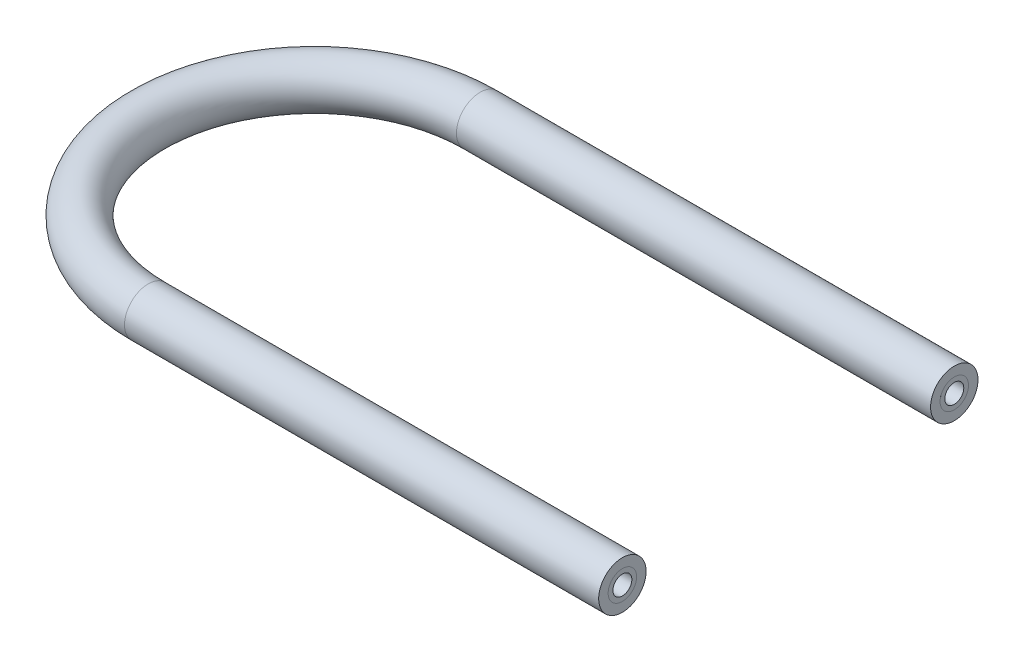
ISO-10303-21;
HEADER;
FILE_DESCRIPTION(('STEP AP214'),'2;1');
FILE_NAME('part.step','',(''),(''),'','','');
FILE_SCHEMA(('AUTOMOTIVE_DESIGN { 1 0 10303 214 1 1 1 1 }'));
ENDSEC;
DATA;
#1=APPLICATION_CONTEXT('core data for automotive mechanical design processes');
#2=APPLICATION_PROTOCOL_DEFINITION('international standard','automotive_design',2000,#1);
#3=PRODUCT_CONTEXT('',#1,'mechanical');
#4=PRODUCT('Part','Part','',(#3));
#5=PRODUCT_RELATED_PRODUCT_CATEGORY('part','',(#4));
#6=PRODUCT_DEFINITION_FORMATION('','',#4);
#7=PRODUCT_DEFINITION_CONTEXT('part definition',#1,'design');
#8=PRODUCT_DEFINITION('design','',#6,#7);
#9=PRODUCT_DEFINITION_SHAPE('','',#8);
#10=(LENGTH_UNIT() NAMED_UNIT(*) SI_UNIT(.MILLI.,.METRE.));
#11=(NAMED_UNIT(*) PLANE_ANGLE_UNIT() SI_UNIT($,.RADIAN.));
#12=(NAMED_UNIT(*) SI_UNIT($,.STERADIAN.) SOLID_ANGLE_UNIT());
#13=UNCERTAINTY_MEASURE_WITH_UNIT(LENGTH_MEASURE(1.E-05),#10,'distance_accuracy_value','');
#14=(GEOMETRIC_REPRESENTATION_CONTEXT(3) GLOBAL_UNCERTAINTY_ASSIGNED_CONTEXT((#13)) GLOBAL_UNIT_ASSIGNED_CONTEXT((#10,
#11,#12)) REPRESENTATION_CONTEXT('',''));
#15=CARTESIAN_POINT('',(0.,0.,0.));
#16=DIRECTION('',(0.,0.,1.));
#17=DIRECTION('',(1.,0.,0.));
#18=AXIS2_PLACEMENT_3D('',#15,#16,#17);
#19=CARTESIAN_POINT('',(-100.,0.,35.));
#20=DIRECTION('',(1.,0.,0.));
#21=DIRECTION('',(0.,0.,-1.));
#22=AXIS2_PLACEMENT_3D('',#19,#20,#21);
#23=CYLINDRICAL_SURFACE('',#22,3.);
#24=CARTESIAN_POINT('',(-100.,0.,35.));
#25=DIRECTION('',(1.,0.,0.));
#26=DIRECTION('',(0.,0.,-1.));
#27=AXIS2_PLACEMENT_3D('',#24,#25,#26);
#28=CIRCLE('',#27,3.);
#29=CARTESIAN_POINT('',(-100.,0.,38.));
#30=VERTEX_POINT('',#29);
#31=EDGE_CURVE('E11',#30,#30,#28,.T.);
#32=ORIENTED_EDGE('',*,*,#31,.T.);
#33=EDGE_LOOP('',(#32));
#34=FACE_BOUND('',#33,.T.);
#35=CARTESIAN_POINT('',(0.,0.,35.));
#36=DIRECTION('',(1.,0.,0.));
#37=DIRECTION('',(0.,0.,-1.));
#38=AXIS2_PLACEMENT_3D('',#35,#36,#37);
#39=CIRCLE('',#38,3.);
#40=CARTESIAN_POINT('',(0.,0.,32.));
#41=VERTEX_POINT('',#40);
#42=EDGE_CURVE('E57',#41,#41,#39,.T.);
#43=ORIENTED_EDGE('',*,*,#42,.F.);
#44=EDGE_LOOP('',(#43));
#45=FACE_BOUND('',#44,.T.);
#46=ADVANCED_FACE('F54',(#34,#45),#23,.T.);
#47=CARTESIAN_POINT('',(0.,0.,35.));
#48=DIRECTION('',(1.,0.,0.));
#49=DIRECTION('',(0.,0.,-1.));
#50=AXIS2_PLACEMENT_3D('',#47,#48,#49);
#51=PLANE('',#50);
#52=CARTESIAN_POINT('',(0.,0.,35.));
#53=DIRECTION('',(1.,0.,0.));
#54=DIRECTION('',(0.,0.,-1.));
#55=AXIS2_PLACEMENT_3D('',#52,#53,#54);
#56=CIRCLE('',#55,2.);
#57=CARTESIAN_POINT('',(0.,0.,33.));
#58=VERTEX_POINT('',#57);
#59=EDGE_CURVE('E66',#58,#58,#56,.T.);
#60=ORIENTED_EDGE('',*,*,#59,.F.);
#61=EDGE_LOOP('',(#60));
#62=FACE_BOUND('',#61,.T.);
#63=ORIENTED_EDGE('',*,*,#42,.T.);
#64=EDGE_LOOP('',(#63));
#65=FACE_BOUND('',#64,.T.);
#66=ADVANCED_FACE('F109',(#62,#65),#51,.T.);
#67=CARTESIAN_POINT('',(-100.,0.,35.));
#68=DIRECTION('',(1.,0.,0.));
#69=DIRECTION('',(0.,0.,-1.));
#70=AXIS2_PLACEMENT_3D('',#67,#68,#69);
#71=CYLINDRICAL_SURFACE('',#70,2.);
#72=CARTESIAN_POINT('',(-100.,0.,35.));
#73=DIRECTION('',(1.,0.,0.));
#74=DIRECTION('',(0.,0.,-1.));
#75=AXIS2_PLACEMENT_3D('',#72,#73,#74);
#76=CIRCLE('',#75,2.);
#77=CARTESIAN_POINT('',(-100.,0.,37.));
#78=VERTEX_POINT('',#77);
#79=EDGE_CURVE('E64',#78,#78,#76,.T.);
#80=ORIENTED_EDGE('',*,*,#79,.F.);
#81=EDGE_LOOP('',(#80));
#82=FACE_BOUND('',#81,.T.);
#83=ORIENTED_EDGE('',*,*,#59,.T.);
#84=EDGE_LOOP('',(#83));
#85=FACE_BOUND('',#84,.T.);
#86=ADVANCED_FACE('F103',(#82,#85),#71,.F.);
#87=CARTESIAN_POINT('',(-100.,0.,0.));
#88=DIRECTION('',(0.,1.,0.));
#89=DIRECTION('',(0.,0.,1.));
#90=AXIS2_PLACEMENT_3D('',#87,#88,#89);
#91=TOROIDAL_SURFACE('',#90,35.,3.);
#92=CARTESIAN_POINT('',(-100.,0.,-35.));
#93=DIRECTION('',(-1.,0.,0.));
#94=DIRECTION('',(0.,0.,1.));
#95=AXIS2_PLACEMENT_3D('',#92,#93,#94);
#96=CIRCLE('',#95,3.);
#97=CARTESIAN_POINT('',(-100.,0.,-38.));
#98=VERTEX_POINT('',#97);
#99=EDGE_CURVE('E72',#98,#98,#96,.T.);
#100=CARTESIAN_POINT('',(-100.,0.,0.));
#101=DIRECTION('',(0.,1.,0.));
#102=DIRECTION('',(0.,0.,1.));
#103=AXIS2_PLACEMENT_3D('',#100,#101,#102);
#104=CIRCLE('',#103,38.);
#105=EDGE_CURVE('',#98,#30,#104,.T.);
#106=ORIENTED_EDGE('',*,*,#99,.T.);
#107=ORIENTED_EDGE('',*,*,#31,.F.);
#108=ORIENTED_EDGE('',*,*,#105,.T.);
#109=ORIENTED_EDGE('',*,*,#105,.F.);
#110=EDGE_LOOP('',(#106,#108,#107,#109));
#111=FACE_BOUND('',#110,.T.);
#112=ADVANCED_FACE('F97',(#111),#91,.T.);
#113=CARTESIAN_POINT('',(-100.,0.,0.));
#114=DIRECTION('',(0.,1.,0.));
#115=DIRECTION('',(0.,0.,1.));
#116=AXIS2_PLACEMENT_3D('',#113,#114,#115);
#117=TOROIDAL_SURFACE('',#116,35.,2.);
#118=CARTESIAN_POINT('',(-100.,0.,-35.));
#119=DIRECTION('',(-1.,0.,0.));
#120=DIRECTION('',(0.,0.,1.));
#121=AXIS2_PLACEMENT_3D('',#118,#119,#120);
#122=CIRCLE('',#121,2.);
#123=CARTESIAN_POINT('',(-100.,0.,-37.));
#124=VERTEX_POINT('',#123);
#125=EDGE_CURVE('E69',#124,#124,#122,.F.);
#126=CARTESIAN_POINT('',(-100.,0.,0.));
#127=DIRECTION('',(0.,1.,0.));
#128=DIRECTION('',(0.,0.,1.));
#129=AXIS2_PLACEMENT_3D('',#126,#127,#128);
#130=CIRCLE('',#129,37.);
#131=EDGE_CURVE('',#124,#78,#130,.T.);
#132=ORIENTED_EDGE('',*,*,#125,.T.);
#133=ORIENTED_EDGE('',*,*,#79,.T.);
#134=ORIENTED_EDGE('',*,*,#131,.T.);
#135=ORIENTED_EDGE('',*,*,#131,.F.);
#136=EDGE_LOOP('',(#132,#134,#133,#135));
#137=FACE_BOUND('',#136,.T.);
#138=ADVANCED_FACE('F94',(#137),#117,.F.);
#139=CARTESIAN_POINT('',(-100.,0.,-35.));
#140=DIRECTION('',(1.,0.,0.));
#141=DIRECTION('',(0.,0.,-1.));
#142=AXIS2_PLACEMENT_3D('',#139,#140,#141);
#143=CYLINDRICAL_SURFACE('',#142,3.);
#144=ORIENTED_EDGE('',*,*,#99,.F.);
#145=EDGE_LOOP('',(#144));
#146=FACE_BOUND('',#145,.T.);
#147=CARTESIAN_POINT('',(0.,0.,-35.));
#148=DIRECTION('',(1.,0.,0.));
#149=DIRECTION('',(0.,0.,1.));
#150=AXIS2_PLACEMENT_3D('',#147,#148,#149);
#151=CIRCLE('',#150,3.);
#152=CARTESIAN_POINT('',(0.,0.,-32.));
#153=VERTEX_POINT('',#152);
#154=EDGE_CURVE('E75',#153,#153,#151,.T.);
#155=ORIENTED_EDGE('',*,*,#154,.F.);
#156=EDGE_LOOP('',(#155));
#157=FACE_BOUND('',#156,.T.);
#158=ADVANCED_FACE('F89',(#146,#157),#143,.T.);
#159=CARTESIAN_POINT('',(0.,0.,-35.));
#160=DIRECTION('',(-1.,0.,0.));
#161=DIRECTION('',(0.,0.,1.));
#162=AXIS2_PLACEMENT_3D('',#159,#160,#161);
#163=PLANE('',#162);
#164=CARTESIAN_POINT('',(0.,0.,-35.));
#165=DIRECTION('',(1.,0.,0.));
#166=DIRECTION('',(0.,0.,1.));
#167=AXIS2_PLACEMENT_3D('',#164,#165,#166);
#168=CIRCLE('',#167,2.);
#169=CARTESIAN_POINT('',(0.,0.,-33.));
#170=VERTEX_POINT('',#169);
#171=EDGE_CURVE('E80',#170,#170,#168,.T.);
#172=ORIENTED_EDGE('',*,*,#171,.F.);
#173=EDGE_LOOP('',(#172));
#174=FACE_BOUND('',#173,.T.);
#175=ORIENTED_EDGE('',*,*,#154,.T.);
#176=EDGE_LOOP('',(#175));
#177=FACE_BOUND('',#176,.T.);
#178=ADVANCED_FACE('F86',(#174,#177),#163,.F.);
#179=CARTESIAN_POINT('',(-100.,0.,-35.));
#180=DIRECTION('',(1.,0.,0.));
#181=DIRECTION('',(0.,0.,-1.));
#182=AXIS2_PLACEMENT_3D('',#179,#180,#181);
#183=CYLINDRICAL_SURFACE('',#182,2.);
#184=ORIENTED_EDGE('',*,*,#125,.F.);
#185=EDGE_LOOP('',(#184));
#186=FACE_BOUND('',#185,.T.);
#187=ORIENTED_EDGE('',*,*,#171,.T.);
#188=EDGE_LOOP('',(#187));
#189=FACE_BOUND('',#188,.T.);
#190=ADVANCED_FACE('F84',(#186,#189),#183,.F.);
#191=CLOSED_SHELL('',(#46,#66,#86,#112,#138,#158,#178,#190));
#192=MANIFOLD_SOLID_BREP('B2_NOT_SHOWN',#191);
#193=CARTESIAN_POINT('',(-100.,0.,-35.));
#194=DIRECTION('',(1.,0.,0.));
#195=DIRECTION('',(0.,0.,-1.));
#196=AXIS2_PLACEMENT_3D('',#193,#194,#195);
#197=CYLINDRICAL_SURFACE('',#196,5.);
#198=CARTESIAN_POINT('',(-100.,0.,-35.));
#199=DIRECTION('',(1.,0.,0.));
#200=DIRECTION('',(0.,0.,-1.));
#201=AXIS2_PLACEMENT_3D('',#198,#199,#200);
#202=CIRCLE('',#201,5.);
#203=CARTESIAN_POINT('',(-100.,0.,-40.));
#204=VERTEX_POINT('',#203);
#205=EDGE_CURVE('E225',#204,#204,#202,.F.);
#206=ORIENTED_EDGE('',*,*,#205,.F.);
#207=EDGE_LOOP('',(#206));
#208=FACE_BOUND('',#207,.T.);
#209=CARTESIAN_POINT('',(0.,0.,-35.));
#210=DIRECTION('',(1.,0.,0.));
#211=DIRECTION('',(0.,0.,-1.));
#212=AXIS2_PLACEMENT_3D('',#209,#210,#211);
#213=CIRCLE('',#212,5.);
#214=CARTESIAN_POINT('',(0.,0.,-40.));
#215=VERTEX_POINT('',#214);
#216=EDGE_CURVE('E232',#215,#215,#213,.F.);
#217=ORIENTED_EDGE('',*,*,#216,.T.);
#218=EDGE_LOOP('',(#217));
#219=FACE_BOUND('',#218,.T.);
#220=ADVANCED_FACE('F218',(#208,#219),#197,.T.);
#221=CARTESIAN_POINT('',(-100.,0.,-35.));
#222=DIRECTION('',(1.,0.,0.));
#223=DIRECTION('',(0.,0.,-1.));
#224=AXIS2_PLACEMENT_3D('',#221,#222,#223);
#225=CYLINDRICAL_SURFACE('',#224,3.);
#226=CARTESIAN_POINT('',(-100.,0.,-35.));
#227=DIRECTION('',(1.,0.,0.));
#228=DIRECTION('',(0.,0.,-1.));
#229=AXIS2_PLACEMENT_3D('',#226,#227,#228);
#230=CIRCLE('',#229,3.);
#231=CARTESIAN_POINT('',(-100.,0.,-38.));
#232=VERTEX_POINT('',#231);
#233=EDGE_CURVE('E53',#232,#232,#230,.F.);
#234=ORIENTED_EDGE('',*,*,#233,.T.);
#235=EDGE_LOOP('',(#234));
#236=FACE_BOUND('',#235,.T.);
#237=CARTESIAN_POINT('',(0.,0.,-35.));
#238=DIRECTION('',(1.,0.,0.));
#239=DIRECTION('',(0.,0.,-1.));
#240=AXIS2_PLACEMENT_3D('',#237,#238,#239);
#241=CIRCLE('',#240,3.);
#242=CARTESIAN_POINT('',(0.,0.,-38.));
#243=VERTEX_POINT('',#242);
#244=EDGE_CURVE('E221',#243,#243,#241,.F.);
#245=ORIENTED_EDGE('',*,*,#244,.F.);
#246=EDGE_LOOP('',(#245));
#247=FACE_BOUND('',#246,.T.);
#248=ADVANCED_FACE('F271',(#236,#247),#225,.F.);
#249=CARTESIAN_POINT('',(0.,0.,0.));
#250=DIRECTION('',(1.,0.,0.));
#251=DIRECTION('',(0.,0.,-1.));
#252=AXIS2_PLACEMENT_3D('',#249,#250,#251);
#253=PLANE('',#252);
#254=ORIENTED_EDGE('',*,*,#216,.F.);
#255=EDGE_LOOP('',(#254));
#256=FACE_BOUND('',#255,.T.);
#257=ORIENTED_EDGE('',*,*,#244,.T.);
#258=EDGE_LOOP('',(#257));
#259=FACE_BOUND('',#258,.T.);
#260=ADVANCED_FACE('F276',(#256,#259),#253,.T.);
#261=CARTESIAN_POINT('',(-100.,0.,0.));
#262=DIRECTION('',(0.,1.,0.));
#263=DIRECTION('',(0.,0.,1.));
#264=AXIS2_PLACEMENT_3D('',#261,#262,#263);
#265=TOROIDAL_SURFACE('',#264,35.,5.);
#266=CARTESIAN_POINT('',(-100.,0.,35.));
#267=DIRECTION('',(1.,0.,0.));
#268=DIRECTION('',(0.,0.,-1.));
#269=AXIS2_PLACEMENT_3D('',#266,#267,#268);
#270=CIRCLE('',#269,5.);
#271=CARTESIAN_POINT('',(-100.,0.,40.));
#272=VERTEX_POINT('',#271);
#273=EDGE_CURVE('E239',#272,#272,#270,.T.);
#274=CARTESIAN_POINT('',(-100.,0.,0.));
#275=DIRECTION('',(0.,1.,0.));
#276=DIRECTION('',(0.,0.,1.));
#277=AXIS2_PLACEMENT_3D('',#274,#275,#276);
#278=CIRCLE('',#277,40.);
#279=EDGE_CURVE('',#204,#272,#278,.T.);
#280=ORIENTED_EDGE('',*,*,#205,.T.);
#281=ORIENTED_EDGE('',*,*,#273,.F.);
#282=ORIENTED_EDGE('',*,*,#279,.T.);
#283=ORIENTED_EDGE('',*,*,#279,.F.);
#284=EDGE_LOOP('',(#280,#282,#281,#283));
#285=FACE_BOUND('',#284,.T.);
#286=ADVANCED_FACE('F269',(#285),#265,.T.);
#287=CARTESIAN_POINT('',(-100.,0.,0.));
#288=DIRECTION('',(0.,1.,0.));
#289=DIRECTION('',(0.,0.,1.));
#290=AXIS2_PLACEMENT_3D('',#287,#288,#289);
#291=TOROIDAL_SURFACE('',#290,35.,3.);
#292=CARTESIAN_POINT('',(-100.,0.,35.));
#293=DIRECTION('',(1.,0.,0.));
#294=DIRECTION('',(0.,0.,-1.));
#295=AXIS2_PLACEMENT_3D('',#292,#293,#294);
#296=CIRCLE('',#295,3.);
#297=CARTESIAN_POINT('',(-100.,0.,38.));
#298=VERTEX_POINT('',#297);
#299=EDGE_CURVE('E234',#298,#298,#296,.F.);
#300=CARTESIAN_POINT('',(-100.,0.,0.));
#301=DIRECTION('',(0.,1.,0.));
#302=DIRECTION('',(0.,0.,1.));
#303=AXIS2_PLACEMENT_3D('',#300,#301,#302);
#304=CIRCLE('',#303,38.);
#305=EDGE_CURVE('',#232,#298,#304,.T.);
#306=ORIENTED_EDGE('',*,*,#233,.F.);
#307=ORIENTED_EDGE('',*,*,#299,.F.);
#308=ORIENTED_EDGE('',*,*,#305,.T.);
#309=ORIENTED_EDGE('',*,*,#305,.F.);
#310=EDGE_LOOP('',(#306,#308,#307,#309));
#311=FACE_BOUND('',#310,.T.);
#312=ADVANCED_FACE('F267',(#311),#291,.F.);
#313=CARTESIAN_POINT('',(-100.,0.,35.));
#314=DIRECTION('',(1.,0.,0.));
#315=DIRECTION('',(0.,0.,-1.));
#316=AXIS2_PLACEMENT_3D('',#313,#314,#315);
#317=CYLINDRICAL_SURFACE('',#316,3.);
#318=ORIENTED_EDGE('',*,*,#299,.T.);
#319=EDGE_LOOP('',(#318));
#320=FACE_BOUND('',#319,.T.);
#321=CARTESIAN_POINT('',(0.,0.,35.));
#322=DIRECTION('',(1.,0.,0.));
#323=DIRECTION('',(0.,0.,-1.));
#324=AXIS2_PLACEMENT_3D('',#321,#322,#323);
#325=CIRCLE('',#324,3.);
#326=CARTESIAN_POINT('',(0.,0.,32.));
#327=VERTEX_POINT('',#326);
#328=EDGE_CURVE('E248',#327,#327,#325,.T.);
#329=ORIENTED_EDGE('',*,*,#328,.T.);
#330=EDGE_LOOP('',(#329));
#331=FACE_BOUND('',#330,.T.);
#332=ADVANCED_FACE('F252',(#320,#331),#317,.F.);
#333=CARTESIAN_POINT('',(-100.,0.,35.));
#334=DIRECTION('',(1.,0.,0.));
#335=DIRECTION('',(0.,0.,-1.));
#336=AXIS2_PLACEMENT_3D('',#333,#334,#335);
#337=CYLINDRICAL_SURFACE('',#336,5.);
#338=ORIENTED_EDGE('',*,*,#273,.T.);
#339=EDGE_LOOP('',(#338));
#340=FACE_BOUND('',#339,.T.);
#341=CARTESIAN_POINT('',(0.,0.,35.));
#342=DIRECTION('',(1.,0.,0.));
#343=DIRECTION('',(0.,0.,-1.));
#344=AXIS2_PLACEMENT_3D('',#341,#342,#343);
#345=CIRCLE('',#344,5.);
#346=CARTESIAN_POINT('',(0.,0.,30.));
#347=VERTEX_POINT('',#346);
#348=EDGE_CURVE('E244',#347,#347,#345,.T.);
#349=ORIENTED_EDGE('',*,*,#348,.F.);
#350=EDGE_LOOP('',(#349));
#351=FACE_BOUND('',#350,.T.);
#352=ADVANCED_FACE('F257',(#340,#351),#337,.T.);
#353=CARTESIAN_POINT('',(0.,0.,0.));
#354=DIRECTION('',(1.,0.,0.));
#355=DIRECTION('',(0.,0.,-1.));
#356=AXIS2_PLACEMENT_3D('',#353,#354,#355);
#357=PLANE('',#356);
#358=ORIENTED_EDGE('',*,*,#328,.F.);
#359=EDGE_LOOP('',(#358));
#360=FACE_BOUND('',#359,.T.);
#361=ORIENTED_EDGE('',*,*,#348,.T.);
#362=EDGE_LOOP('',(#361));
#363=FACE_BOUND('',#362,.T.);
#364=ADVANCED_FACE('F254',(#360,#363),#357,.T.);
#365=CLOSED_SHELL('',(#220,#248,#260,#286,#312,#332,#352,#364));
#366=MANIFOLD_SOLID_BREP('B6',#365);
#367=ADVANCED_BREP_SHAPE_REPRESENTATION('',(#18,#192,#366),#14);
#368=SHAPE_DEFINITION_REPRESENTATION(#9,#367);
ENDSEC;
END-ISO-10303-21;
